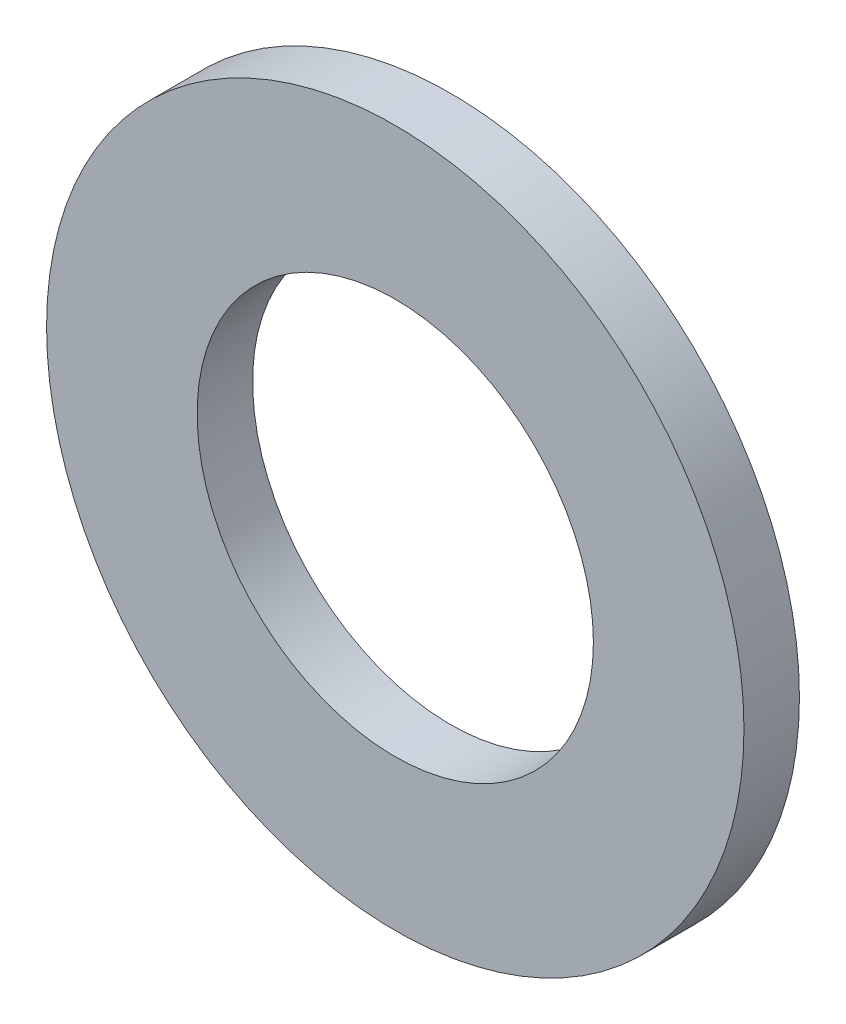
ISO-10303-21;
HEADER;
FILE_DESCRIPTION(('STEP AP214'),'2;1');
FILE_NAME('part.step','',(''),(''),'','','');
FILE_SCHEMA(('AUTOMOTIVE_DESIGN { 1 0 10303 214 1 1 1 1 }'));
ENDSEC;
DATA;
#1=APPLICATION_CONTEXT('core data for automotive mechanical design processes');
#2=APPLICATION_PROTOCOL_DEFINITION('international standard','automotive_design',2000,#1);
#3=PRODUCT_CONTEXT('',#1,'mechanical');
#4=PRODUCT('Part','Part','',(#3));
#5=PRODUCT_RELATED_PRODUCT_CATEGORY('part','',(#4));
#6=PRODUCT_DEFINITION_FORMATION('','',#4);
#7=PRODUCT_DEFINITION_CONTEXT('part definition',#1,'design');
#8=PRODUCT_DEFINITION('design','',#6,#7);
#9=PRODUCT_DEFINITION_SHAPE('','',#8);
#10=(LENGTH_UNIT() NAMED_UNIT(*) SI_UNIT(.MILLI.,.METRE.));
#11=(NAMED_UNIT(*) PLANE_ANGLE_UNIT() SI_UNIT($,.RADIAN.));
#12=(NAMED_UNIT(*) SI_UNIT($,.STERADIAN.) SOLID_ANGLE_UNIT());
#13=UNCERTAINTY_MEASURE_WITH_UNIT(LENGTH_MEASURE(1.E-05),#10,'distance_accuracy_value','');
#14=(GEOMETRIC_REPRESENTATION_CONTEXT(3) GLOBAL_UNCERTAINTY_ASSIGNED_CONTEXT((#13)) GLOBAL_UNIT_ASSIGNED_CONTEXT((#10,
#11,#12)) REPRESENTATION_CONTEXT('',''));
#15=CARTESIAN_POINT('',(0.,0.,0.));
#16=DIRECTION('',(0.,0.,1.));
#17=DIRECTION('',(1.,0.,0.));
#18=AXIS2_PLACEMENT_3D('',#15,#16,#17);
#19=CARTESIAN_POINT('',(0.,0.,1.75));
#20=DIRECTION('',(0.,0.,1.));
#21=DIRECTION('',(1.,0.,0.));
#22=AXIS2_PLACEMENT_3D('',#19,#20,#21);
#23=PLANE('',#22);
#24=CARTESIAN_POINT('',(0.,0.,1.75));
#25=DIRECTION('',(0.,0.,1.));
#26=DIRECTION('',(1.,0.,0.));
#27=AXIS2_PLACEMENT_3D('',#24,#25,#26);
#28=CIRCLE('',#27,22.);
#29=CARTESIAN_POINT('',(22.,0.,1.75));
#30=VERTEX_POINT('',#29);
#31=EDGE_CURVE('E10',#30,#30,#28,.T.);
#32=ORIENTED_EDGE('',*,*,#31,.T.);
#33=EDGE_LOOP('',(#32));
#34=FACE_BOUND('',#33,.T.);
#35=CARTESIAN_POINT('',(0.,0.,1.75));
#36=DIRECTION('',(0.,0.,1.));
#37=DIRECTION('',(1.,0.,0.));
#38=AXIS2_PLACEMENT_3D('',#35,#36,#37);
#39=CIRCLE('',#38,12.5);
#40=CARTESIAN_POINT('',(12.5,0.,1.75));
#41=VERTEX_POINT('',#40);
#42=EDGE_CURVE('E42',#41,#41,#39,.T.);
#43=ORIENTED_EDGE('',*,*,#42,.F.);
#44=EDGE_LOOP('',(#43));
#45=FACE_BOUND('',#44,.T.);
#46=ADVANCED_FACE('F31',(#34,#45),#23,.T.);
#47=CARTESIAN_POINT('',(0.,0.,-1.75));
#48=DIRECTION('',(0.,0.,1.));
#49=DIRECTION('',(1.,0.,0.));
#50=AXIS2_PLACEMENT_3D('',#47,#48,#49);
#51=PLANE('',#50);
#52=CARTESIAN_POINT('',(0.,0.,-1.75));
#53=DIRECTION('',(0.,0.,1.));
#54=DIRECTION('',(1.,0.,0.));
#55=AXIS2_PLACEMENT_3D('',#52,#53,#54);
#56=CIRCLE('',#55,22.);
#57=CARTESIAN_POINT('',(22.,0.,-1.75));
#58=VERTEX_POINT('',#57);
#59=EDGE_CURVE('E35',#58,#58,#56,.T.);
#60=ORIENTED_EDGE('',*,*,#59,.F.);
#61=EDGE_LOOP('',(#60));
#62=FACE_BOUND('',#61,.T.);
#63=CARTESIAN_POINT('',(0.,0.,-1.75));
#64=DIRECTION('',(0.,0.,1.));
#65=DIRECTION('',(1.,0.,0.));
#66=AXIS2_PLACEMENT_3D('',#63,#64,#65);
#67=CIRCLE('',#66,12.5);
#68=CARTESIAN_POINT('',(12.5,0.,-1.75));
#69=VERTEX_POINT('',#68);
#70=EDGE_CURVE('E44',#69,#69,#67,.T.);
#71=ORIENTED_EDGE('',*,*,#70,.T.);
#72=EDGE_LOOP('',(#71));
#73=FACE_BOUND('',#72,.T.);
#74=ADVANCED_FACE('F54',(#62,#73),#51,.F.);
#75=CARTESIAN_POINT('',(0.,0.,1.75));
#76=DIRECTION('',(0.,0.,-1.));
#77=DIRECTION('',(-1.,0.,0.));
#78=AXIS2_PLACEMENT_3D('',#75,#76,#77);
#79=CYLINDRICAL_SURFACE('',#78,22.);
#80=ORIENTED_EDGE('',*,*,#31,.F.);
#81=EDGE_LOOP('',(#80));
#82=FACE_BOUND('',#81,.T.);
#83=ORIENTED_EDGE('',*,*,#59,.T.);
#84=EDGE_LOOP('',(#83));
#85=FACE_BOUND('',#84,.T.);
#86=ADVANCED_FACE('F33',(#82,#85),#79,.T.);
#87=CARTESIAN_POINT('',(0.,0.,1.75));
#88=DIRECTION('',(0.,0.,-1.));
#89=DIRECTION('',(-1.,0.,0.));
#90=AXIS2_PLACEMENT_3D('',#87,#88,#89);
#91=CYLINDRICAL_SURFACE('',#90,12.5);
#92=ORIENTED_EDGE('',*,*,#42,.T.);
#93=EDGE_LOOP('',(#92));
#94=FACE_BOUND('',#93,.T.);
#95=ORIENTED_EDGE('',*,*,#70,.F.);
#96=EDGE_LOOP('',(#95));
#97=FACE_BOUND('',#96,.T.);
#98=ADVANCED_FACE('F50',(#94,#97),#91,.F.);
#99=CLOSED_SHELL('',(#46,#74,#86,#98));
#100=MANIFOLD_SOLID_BREP('B2',#99);
#101=ADVANCED_BREP_SHAPE_REPRESENTATION('',(#18,#100),#14);
#102=SHAPE_DEFINITION_REPRESENTATION(#9,#101);
ENDSEC;
END-ISO-10303-21;
